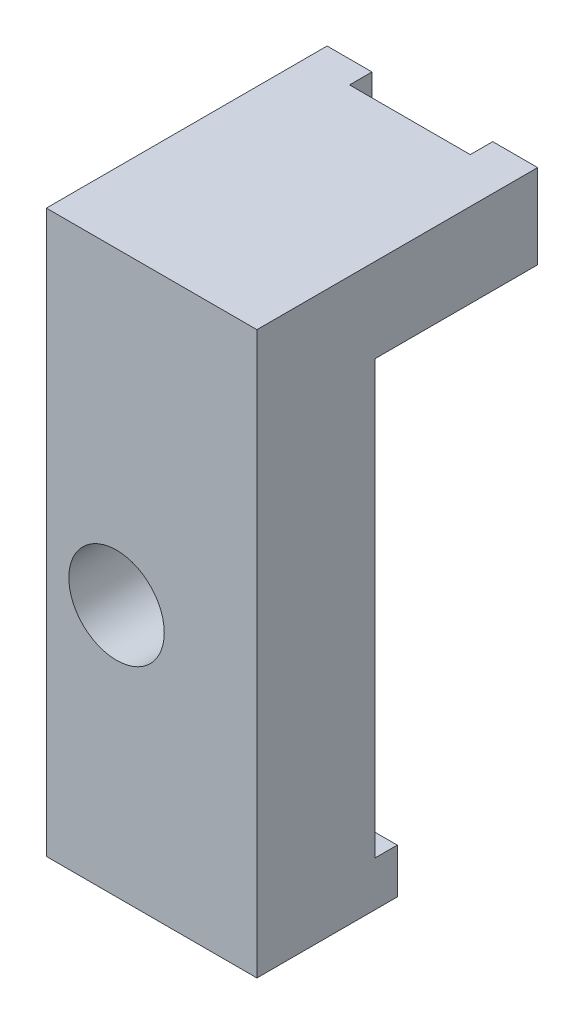
ISO-10303-21;
HEADER;
FILE_DESCRIPTION(('STEP AP214'),'2;1');
FILE_NAME('part.step','',(''),(''),'','','');
FILE_SCHEMA(('AUTOMOTIVE_DESIGN { 1 0 10303 214 1 1 1 1 }'));
ENDSEC;
DATA;
#1=APPLICATION_CONTEXT('core data for automotive mechanical design processes');
#2=APPLICATION_PROTOCOL_DEFINITION('international standard','automotive_design',2000,#1);
#3=PRODUCT_CONTEXT('',#1,'mechanical');
#4=PRODUCT('Part','Part','',(#3));
#5=PRODUCT_RELATED_PRODUCT_CATEGORY('part','',(#4));
#6=PRODUCT_DEFINITION_FORMATION('','',#4);
#7=PRODUCT_DEFINITION_CONTEXT('part definition',#1,'design');
#8=PRODUCT_DEFINITION('design','',#6,#7);
#9=PRODUCT_DEFINITION_SHAPE('','',#8);
#10=(LENGTH_UNIT() NAMED_UNIT(*) SI_UNIT(.MILLI.,.METRE.));
#11=(NAMED_UNIT(*) PLANE_ANGLE_UNIT() SI_UNIT($,.RADIAN.));
#12=(NAMED_UNIT(*) SI_UNIT($,.STERADIAN.) SOLID_ANGLE_UNIT());
#13=UNCERTAINTY_MEASURE_WITH_UNIT(LENGTH_MEASURE(1.E-05),#10,'distance_accuracy_value','');
#14=(GEOMETRIC_REPRESENTATION_CONTEXT(3) GLOBAL_UNCERTAINTY_ASSIGNED_CONTEXT((#13)) GLOBAL_UNIT_ASSIGNED_CONTEXT((#10,
#11,#12)) REPRESENTATION_CONTEXT('',''));
#15=CARTESIAN_POINT('',(0.,0.,0.));
#16=DIRECTION('',(0.,0.,1.));
#17=DIRECTION('',(1.,0.,0.));
#18=AXIS2_PLACEMENT_3D('',#15,#16,#17);
#19=CARTESIAN_POINT('',(0.,0.,-6.35));
#20=DIRECTION('',(0.,0.,1.));
#21=DIRECTION('',(1.,0.,0.));
#22=AXIS2_PLACEMENT_3D('',#19,#20,#21);
#23=PLANE('',#22);
#24=DIRECTION('',(1.,0.,0.));
#25=VECTOR('',#24,1.);
#26=CARTESIAN_POINT('',(-4.76350000000001,8.89,-6.35));
#27=LINE('',#26,#25);
#28=CARTESIAN_POINT('',(2.7305,8.89,-6.35));
#29=VERTEX_POINT('',#28);
#30=CARTESIAN_POINT('',(4.7625,8.89,-6.35));
#31=VERTEX_POINT('',#30);
#32=EDGE_CURVE('E191',#29,#31,#27,.T.);
#33=ORIENTED_EDGE('',*,*,#32,.F.);
#34=DIRECTION('',(0.,1.,0.));
#35=VECTOR('',#34,1.);
#36=CARTESIAN_POINT('',(2.7305,-12.701,-6.35));
#37=LINE('',#36,#35);
#38=CARTESIAN_POINT('',(2.7305,12.7,-6.35));
#39=VERTEX_POINT('',#38);
#40=EDGE_CURVE('E173',#29,#39,#37,.T.);
#41=ORIENTED_EDGE('',*,*,#40,.T.);
#42=DIRECTION('',(-1.,0.,0.));
#43=VECTOR('',#42,1.);
#44=CARTESIAN_POINT('',(-4.7625,12.7,-6.35));
#45=LINE('',#44,#43);
#46=CARTESIAN_POINT('',(4.7625,12.7,-6.35));
#47=VERTEX_POINT('',#46);
#48=EDGE_CURVE('E208',#47,#39,#45,.T.);
#49=ORIENTED_EDGE('',*,*,#48,.F.);
#50=DIRECTION('',(0.,1.,0.));
#51=VECTOR('',#50,1.);
#52=CARTESIAN_POINT('',(4.7625,12.7,-6.35));
#53=LINE('',#52,#51);
#54=EDGE_CURVE('E131',#31,#47,#53,.T.);
#55=ORIENTED_EDGE('',*,*,#54,.F.);
#56=EDGE_LOOP('',(#33,#41,#49,#55));
#57=FACE_BOUND('',#56,.T.);
#58=ADVANCED_FACE('F33',(#57),#23,.F.);
#59=CARTESIAN_POINT('',(4.7625,12.7,6.35));
#60=DIRECTION('',(-1.,0.,0.));
#61=DIRECTION('',(0.,-1.,0.));
#62=AXIS2_PLACEMENT_3D('',#59,#60,#61);
#63=PLANE('',#62);
#64=DIRECTION('',(0.,-1.,0.));
#65=VECTOR('',#64,1.);
#66=CARTESIAN_POINT('',(4.7625,-12.7,0.));
#67=LINE('',#66,#65);
#68=CARTESIAN_POINT('',(4.7625,-10.668,0.));
#69=VERTEX_POINT('',#68);
#70=CARTESIAN_POINT('',(4.7625,-12.7,0.));
#71=VERTEX_POINT('',#70);
#72=EDGE_CURVE('E189',#69,#71,#67,.T.);
#73=ORIENTED_EDGE('',*,*,#72,.F.);
#74=DIRECTION('',(0.,0.,-1.));
#75=VECTOR('',#74,1.);
#76=CARTESIAN_POINT('',(4.7625,-10.668,0.));
#77=LINE('',#76,#75);
#78=CARTESIAN_POINT('',(4.7625,-10.668,1.016));
#79=VERTEX_POINT('',#78);
#80=EDGE_CURVE('E148',#79,#69,#77,.T.);
#81=ORIENTED_EDGE('',*,*,#80,.F.);
#82=DIRECTION('',(0.,-1.,0.));
#83=VECTOR('',#82,1.);
#84=CARTESIAN_POINT('',(4.7625,-10.668,1.016));
#85=LINE('',#84,#83);
#86=CARTESIAN_POINT('',(4.7625,8.89,1.016));
#87=VERTEX_POINT('',#86);
#88=EDGE_CURVE('E151',#87,#79,#85,.T.);
#89=ORIENTED_EDGE('',*,*,#88,.F.);
#90=DIRECTION('',(0.,0.,1.));
#91=VECTOR('',#90,1.);
#92=CARTESIAN_POINT('',(4.7625,8.89,-6.35));
#93=LINE('',#92,#91);
#94=EDGE_CURVE('E138',#31,#87,#93,.T.);
#95=ORIENTED_EDGE('',*,*,#94,.F.);
#96=ORIENTED_EDGE('',*,*,#54,.T.);
#97=DIRECTION('',(0.,0.,-1.));
#98=VECTOR('',#97,1.);
#99=CARTESIAN_POINT('',(4.7625,12.7,6.35));
#100=LINE('',#99,#98);
#101=CARTESIAN_POINT('',(4.7625,12.7,6.35));
#102=VERTEX_POINT('',#101);
#103=EDGE_CURVE('E11',#102,#47,#100,.T.);
#104=ORIENTED_EDGE('',*,*,#103,.F.);
#105=DIRECTION('',(0.,1.,0.));
#106=VECTOR('',#105,1.);
#107=CARTESIAN_POINT('',(4.7625,12.7,6.35));
#108=LINE('',#107,#106);
#109=CARTESIAN_POINT('',(4.7625,-12.7,6.35));
#110=VERTEX_POINT('',#109);
#111=EDGE_CURVE('E196',#110,#102,#108,.T.);
#112=ORIENTED_EDGE('',*,*,#111,.F.);
#113=DIRECTION('',(0.,0.,-1.));
#114=VECTOR('',#113,1.);
#115=CARTESIAN_POINT('',(4.7625,-12.7,6.35));
#116=LINE('',#115,#114);
#117=EDGE_CURVE('E205',#110,#71,#116,.T.);
#118=ORIENTED_EDGE('',*,*,#117,.T.);
#119=EDGE_LOOP('',(#73,#81,#89,#95,#96,#104,#112,#118));
#120=FACE_BOUND('',#119,.T.);
#121=ADVANCED_FACE('F35',(#120),#63,.F.);
#122=CARTESIAN_POINT('',(-4.7625,12.7,6.35));
#123=DIRECTION('',(0.,-1.,0.));
#124=DIRECTION('',(0.,0.,-1.));
#125=AXIS2_PLACEMENT_3D('',#122,#123,#124);
#126=PLANE('',#125);
#127=ORIENTED_EDGE('',*,*,#48,.T.);
#128=DIRECTION('',(0.,0.,-1.));
#129=VECTOR('',#128,1.);
#130=CARTESIAN_POINT('',(2.7305,12.7,-6.35));
#131=LINE('',#130,#129);
#132=CARTESIAN_POINT('',(2.7305,12.7,-5.334));
#133=VERTEX_POINT('',#132);
#134=EDGE_CURVE('E165',#133,#39,#131,.T.);
#135=ORIENTED_EDGE('',*,*,#134,.F.);
#136=DIRECTION('',(1.,0.,0.));
#137=VECTOR('',#136,1.);
#138=CARTESIAN_POINT('',(2.7305,12.7,-5.334));
#139=LINE('',#138,#137);
#140=CARTESIAN_POINT('',(-2.7305,12.7,-5.334));
#141=VERTEX_POINT('',#140);
#142=EDGE_CURVE('E170',#141,#133,#139,.T.);
#143=ORIENTED_EDGE('',*,*,#142,.F.);
#144=DIRECTION('',(0.,0.,1.));
#145=VECTOR('',#144,1.);
#146=CARTESIAN_POINT('',(-2.7305,12.7,-6.35));
#147=LINE('',#146,#145);
#148=CARTESIAN_POINT('',(-2.7305,12.7,-6.35));
#149=VERTEX_POINT('',#148);
#150=EDGE_CURVE('E167',#149,#141,#147,.T.);
#151=ORIENTED_EDGE('',*,*,#150,.F.);
#152=CARTESIAN_POINT('',(-4.7625,12.7,-6.35));
#153=VERTEX_POINT('',#152);
#154=EDGE_CURVE('E207',#149,#153,#45,.T.);
#155=ORIENTED_EDGE('',*,*,#154,.T.);
#156=DIRECTION('',(0.,0.,-1.));
#157=VECTOR('',#156,1.);
#158=CARTESIAN_POINT('',(-4.7625,12.7,6.35));
#159=LINE('',#158,#157);
#160=CARTESIAN_POINT('',(-4.7625,12.7,6.35));
#161=VERTEX_POINT('',#160);
#162=EDGE_CURVE('E42',#161,#153,#159,.T.);
#163=ORIENTED_EDGE('',*,*,#162,.F.);
#164=DIRECTION('',(-1.,0.,0.));
#165=VECTOR('',#164,1.);
#166=CARTESIAN_POINT('',(-4.7625,12.7,6.35));
#167=LINE('',#166,#165);
#168=EDGE_CURVE('E199',#102,#161,#167,.T.);
#169=ORIENTED_EDGE('',*,*,#168,.F.);
#170=ORIENTED_EDGE('',*,*,#103,.T.);
#171=EDGE_LOOP('',(#127,#135,#143,#151,#155,#163,#169,#170));
#172=FACE_BOUND('',#171,.T.);
#173=ADVANCED_FACE('F233',(#172),#126,.F.);
#174=CARTESIAN_POINT('',(-4.7625,12.7,6.35));
#175=DIRECTION('',(1.,0.,0.));
#176=DIRECTION('',(0.,1.,0.));
#177=AXIS2_PLACEMENT_3D('',#174,#175,#176);
#178=PLANE('',#177);
#179=DIRECTION('',(0.,-1.,0.));
#180=VECTOR('',#179,1.);
#181=CARTESIAN_POINT('',(-4.7625,-10.668,1.016));
#182=LINE('',#181,#180);
#183=CARTESIAN_POINT('',(-4.76250000000001,8.89,1.016));
#184=VERTEX_POINT('',#183);
#185=CARTESIAN_POINT('',(-4.7625,-10.668,1.016));
#186=VERTEX_POINT('',#185);
#187=EDGE_CURVE('E127',#184,#186,#182,.T.);
#188=ORIENTED_EDGE('',*,*,#187,.T.);
#189=DIRECTION('',(0.,0.,-1.));
#190=VECTOR('',#189,1.);
#191=CARTESIAN_POINT('',(-4.7625,-10.668,0.));
#192=LINE('',#191,#190);
#193=CARTESIAN_POINT('',(-4.7625,-10.668,0.));
#194=VERTEX_POINT('',#193);
#195=EDGE_CURVE('E143',#186,#194,#192,.T.);
#196=ORIENTED_EDGE('',*,*,#195,.T.);
#197=DIRECTION('',(0.,1.,0.));
#198=VECTOR('',#197,1.);
#199=CARTESIAN_POINT('',(-4.7625,-12.7,0.));
#200=LINE('',#199,#198);
#201=CARTESIAN_POINT('',(-4.7625,-12.7,0.));
#202=VERTEX_POINT('',#201);
#203=EDGE_CURVE('E185',#202,#194,#200,.T.);
#204=ORIENTED_EDGE('',*,*,#203,.F.);
#205=DIRECTION('',(0.,0.,-1.));
#206=VECTOR('',#205,1.);
#207=CARTESIAN_POINT('',(-4.7625,-12.7,6.35));
#208=LINE('',#207,#206);
#209=CARTESIAN_POINT('',(-4.7625,-12.7,6.35));
#210=VERTEX_POINT('',#209);
#211=EDGE_CURVE('E214',#210,#202,#208,.T.);
#212=ORIENTED_EDGE('',*,*,#211,.F.);
#213=DIRECTION('',(0.,-1.,0.));
#214=VECTOR('',#213,1.);
#215=CARTESIAN_POINT('',(-4.7625,12.7,6.35));
#216=LINE('',#215,#214);
#217=EDGE_CURVE('E201',#161,#210,#216,.T.);
#218=ORIENTED_EDGE('',*,*,#217,.F.);
#219=ORIENTED_EDGE('',*,*,#162,.T.);
#220=DIRECTION('',(0.,-1.,0.));
#221=VECTOR('',#220,1.);
#222=CARTESIAN_POINT('',(-4.7625,12.7,-6.35));
#223=LINE('',#222,#221);
#224=CARTESIAN_POINT('',(-4.7625,8.89,-6.35));
#225=VERTEX_POINT('',#224);
#226=EDGE_CURVE('E130',#153,#225,#223,.T.);
#227=ORIENTED_EDGE('',*,*,#226,.T.);
#228=DIRECTION('',(0.,0.,-1.));
#229=VECTOR('',#228,1.);
#230=CARTESIAN_POINT('',(-4.7625,8.89,-6.35));
#231=LINE('',#230,#229);
#232=EDGE_CURVE('E57',#184,#225,#231,.T.);
#233=ORIENTED_EDGE('',*,*,#232,.F.);
#234=EDGE_LOOP('',(#188,#196,#204,#212,#218,#219,#227,#233));
#235=FACE_BOUND('',#234,.T.);
#236=ADVANCED_FACE('F124',(#235),#178,.F.);
#237=CARTESIAN_POINT('',(-4.7625,-12.7,6.35));
#238=DIRECTION('',(0.,1.,0.));
#239=DIRECTION('',(0.,0.,1.));
#240=AXIS2_PLACEMENT_3D('',#237,#238,#239);
#241=PLANE('',#240);
#242=ORIENTED_EDGE('',*,*,#211,.T.);
#243=DIRECTION('',(1.,0.,0.));
#244=VECTOR('',#243,1.);
#245=CARTESIAN_POINT('',(-4.7635,-12.7,0.));
#246=LINE('',#245,#244);
#247=EDGE_CURVE('E132',#202,#71,#246,.T.);
#248=ORIENTED_EDGE('',*,*,#247,.T.);
#249=ORIENTED_EDGE('',*,*,#117,.F.);
#250=DIRECTION('',(1.,0.,0.));
#251=VECTOR('',#250,1.);
#252=CARTESIAN_POINT('',(-4.7625,-12.7,6.35));
#253=LINE('',#252,#251);
#254=EDGE_CURVE('E203',#210,#110,#253,.T.);
#255=ORIENTED_EDGE('',*,*,#254,.F.);
#256=EDGE_LOOP('',(#242,#248,#249,#255));
#257=FACE_BOUND('',#256,.T.);
#258=ADVANCED_FACE('F251',(#257),#241,.F.);
#259=CARTESIAN_POINT('',(0.,0.,6.35));
#260=DIRECTION('',(0.,0.,1.));
#261=DIRECTION('',(1.,0.,0.));
#262=AXIS2_PLACEMENT_3D('',#259,#260,#261);
#263=PLANE('',#262);
#264=CARTESIAN_POINT('',(-1.5875,-1.27,6.35));
#265=DIRECTION('',(0.,0.,1.));
#266=DIRECTION('',(1.,0.,0.));
#267=AXIS2_PLACEMENT_3D('',#264,#265,#266);
#268=CIRCLE('',#267,2.159);
#269=CARTESIAN_POINT('',(0.571499999999997,-1.27,6.35));
#270=VERTEX_POINT('',#269);
#271=EDGE_CURVE('E176',#270,#270,#268,.T.);
#272=ORIENTED_EDGE('',*,*,#271,.F.);
#273=EDGE_LOOP('',(#272));
#274=FACE_BOUND('',#273,.T.);
#275=ORIENTED_EDGE('',*,*,#111,.T.);
#276=ORIENTED_EDGE('',*,*,#168,.T.);
#277=ORIENTED_EDGE('',*,*,#217,.T.);
#278=ORIENTED_EDGE('',*,*,#254,.T.);
#279=EDGE_LOOP('',(#275,#276,#277,#278));
#280=FACE_BOUND('',#279,.T.);
#281=ADVANCED_FACE('F255',(#274,#280),#263,.T.);
#282=ORIENTED_EDGE('',*,*,#154,.F.);
#283=DIRECTION('',(0.,1.,0.));
#284=VECTOR('',#283,1.);
#285=CARTESIAN_POINT('',(-2.7305,-12.701,-6.35));
#286=LINE('',#285,#284);
#287=CARTESIAN_POINT('',(-2.7305,8.88999999999999,-6.35));
#288=VERTEX_POINT('',#287);
#289=EDGE_CURVE('E179',#288,#149,#286,.T.);
#290=ORIENTED_EDGE('',*,*,#289,.F.);
#291=EDGE_CURVE('E194',#225,#288,#27,.T.);
#292=ORIENTED_EDGE('',*,*,#291,.F.);
#293=ORIENTED_EDGE('',*,*,#226,.F.);
#294=EDGE_LOOP('',(#282,#290,#292,#293));
#295=FACE_BOUND('',#294,.T.);
#296=ADVANCED_FACE('F223',(#295),#23,.F.);
#297=CARTESIAN_POINT('',(-4.7635,-12.7,0.));
#298=DIRECTION('',(0.,0.,1.));
#299=DIRECTION('',(1.,0.,0.));
#300=AXIS2_PLACEMENT_3D('',#297,#298,#299);
#301=PLANE('',#300);
#302=ORIENTED_EDGE('',*,*,#203,.T.);
#303=DIRECTION('',(1.,0.,0.));
#304=VECTOR('',#303,1.);
#305=CARTESIAN_POINT('',(-4.7625,-10.668,0.));
#306=LINE('',#305,#304);
#307=EDGE_CURVE('E155',#194,#69,#306,.T.);
#308=ORIENTED_EDGE('',*,*,#307,.T.);
#309=ORIENTED_EDGE('',*,*,#72,.T.);
#310=ORIENTED_EDGE('',*,*,#247,.F.);
#311=EDGE_LOOP('',(#302,#308,#309,#310));
#312=FACE_BOUND('',#311,.T.);
#313=ADVANCED_FACE('F247',(#312),#301,.F.);
#314=CARTESIAN_POINT('',(-4.76350000000001,8.89,-6.35));
#315=DIRECTION('',(0.,1.,0.));
#316=DIRECTION('',(0.,0.,1.));
#317=AXIS2_PLACEMENT_3D('',#314,#315,#316);
#318=PLANE('',#317);
#319=DIRECTION('',(-1.,0.,0.));
#320=VECTOR('',#319,1.);
#321=CARTESIAN_POINT('',(2.73049999999999,8.89,-5.334));
#322=LINE('',#321,#320);
#323=CARTESIAN_POINT('',(2.7305,8.88999999999999,-5.334));
#324=VERTEX_POINT('',#323);
#325=CARTESIAN_POINT('',(-2.7305,8.89,-5.334));
#326=VERTEX_POINT('',#325);
#327=EDGE_CURVE('E49',#324,#326,#322,.T.);
#328=ORIENTED_EDGE('',*,*,#327,.F.);
#329=DIRECTION('',(0.,0.,1.));
#330=VECTOR('',#329,1.);
#331=CARTESIAN_POINT('',(2.7305,8.89,-6.34999999999999));
#332=LINE('',#331,#330);
#333=EDGE_CURVE('E162',#29,#324,#332,.T.);
#334=ORIENTED_EDGE('',*,*,#333,.F.);
#335=ORIENTED_EDGE('',*,*,#32,.T.);
#336=ORIENTED_EDGE('',*,*,#94,.T.);
#337=DIRECTION('',(1.,0.,0.));
#338=VECTOR('',#337,1.);
#339=CARTESIAN_POINT('',(-4.76250000000001,8.89,1.016));
#340=LINE('',#339,#338);
#341=EDGE_CURVE('E135',#184,#87,#340,.T.);
#342=ORIENTED_EDGE('',*,*,#341,.F.);
#343=ORIENTED_EDGE('',*,*,#232,.T.);
#344=ORIENTED_EDGE('',*,*,#291,.T.);
#345=DIRECTION('',(0.,0.,-1.));
#346=VECTOR('',#345,1.);
#347=CARTESIAN_POINT('',(-2.7305,8.89,-6.34999999999999));
#348=LINE('',#347,#346);
#349=EDGE_CURVE('E159',#326,#288,#348,.T.);
#350=ORIENTED_EDGE('',*,*,#349,.F.);
#351=EDGE_LOOP('',(#328,#334,#335,#336,#342,#343,#344,#350));
#352=FACE_BOUND('',#351,.T.);
#353=ADVANCED_FACE('F136',(#352),#318,.F.);
#354=CARTESIAN_POINT('',(-1.5875,-1.27,-6.351));
#355=DIRECTION('',(0.,0.,1.));
#356=DIRECTION('',(1.,0.,0.));
#357=AXIS2_PLACEMENT_3D('',#354,#355,#356);
#358=CYLINDRICAL_SURFACE('',#357,2.159);
#359=CARTESIAN_POINT('',(-1.5875,-1.27,1.016));
#360=DIRECTION('',(0.,0.,1.));
#361=DIRECTION('',(1.,0.,0.));
#362=AXIS2_PLACEMENT_3D('',#359,#360,#361);
#363=CIRCLE('',#362,2.159);
#364=CARTESIAN_POINT('',(0.571499999999997,-1.27,1.016));
#365=VERTEX_POINT('',#364);
#366=EDGE_CURVE('E37',#365,#365,#363,.F.);
#367=ORIENTED_EDGE('',*,*,#366,.T.);
#368=EDGE_LOOP('',(#367));
#369=FACE_BOUND('',#368,.T.);
#370=ORIENTED_EDGE('',*,*,#271,.T.);
#371=EDGE_LOOP('',(#370));
#372=FACE_BOUND('',#371,.T.);
#373=ADVANCED_FACE('F303',(#369,#372),#358,.F.);
#374=CARTESIAN_POINT('',(2.7305,-12.701,-6.35));
#375=DIRECTION('',(1.,0.,0.));
#376=DIRECTION('',(0.,0.,-1.));
#377=AXIS2_PLACEMENT_3D('',#374,#375,#376);
#378=PLANE('',#377);
#379=ORIENTED_EDGE('',*,*,#333,.T.);
#380=DIRECTION('',(0.,1.,0.));
#381=VECTOR('',#380,1.);
#382=CARTESIAN_POINT('',(2.7305,-12.701,-5.334));
#383=LINE('',#382,#381);
#384=EDGE_CURVE('E174',#324,#133,#383,.T.);
#385=ORIENTED_EDGE('',*,*,#384,.T.);
#386=ORIENTED_EDGE('',*,*,#134,.T.);
#387=ORIENTED_EDGE('',*,*,#40,.F.);
#388=EDGE_LOOP('',(#379,#385,#386,#387));
#389=FACE_BOUND('',#388,.T.);
#390=ADVANCED_FACE('F236',(#389),#378,.F.);
#391=CARTESIAN_POINT('',(2.7305,-12.701,-5.334));
#392=DIRECTION('',(0.,0.,1.));
#393=DIRECTION('',(1.,0.,0.));
#394=AXIS2_PLACEMENT_3D('',#391,#392,#393);
#395=PLANE('',#394);
#396=ORIENTED_EDGE('',*,*,#327,.T.);
#397=DIRECTION('',(0.,1.,0.));
#398=VECTOR('',#397,1.);
#399=CARTESIAN_POINT('',(-2.7305,-12.701,-5.334));
#400=LINE('',#399,#398);
#401=EDGE_CURVE('E177',#326,#141,#400,.T.);
#402=ORIENTED_EDGE('',*,*,#401,.T.);
#403=ORIENTED_EDGE('',*,*,#142,.T.);
#404=ORIENTED_EDGE('',*,*,#384,.F.);
#405=EDGE_LOOP('',(#396,#402,#403,#404));
#406=FACE_BOUND('',#405,.T.);
#407=ADVANCED_FACE('F231',(#406),#395,.F.);
#408=CARTESIAN_POINT('',(-2.7305,-12.701,-6.35));
#409=DIRECTION('',(-1.,0.,0.));
#410=DIRECTION('',(0.,0.,1.));
#411=AXIS2_PLACEMENT_3D('',#408,#409,#410);
#412=PLANE('',#411);
#413=ORIENTED_EDGE('',*,*,#349,.T.);
#414=ORIENTED_EDGE('',*,*,#289,.T.);
#415=ORIENTED_EDGE('',*,*,#150,.T.);
#416=ORIENTED_EDGE('',*,*,#401,.F.);
#417=EDGE_LOOP('',(#413,#414,#415,#416));
#418=FACE_BOUND('',#417,.T.);
#419=ADVANCED_FACE('F228',(#418),#412,.F.);
#420=CARTESIAN_POINT('',(-4.7625,-10.668,1.016));
#421=DIRECTION('',(0.,0.,1.));
#422=DIRECTION('',(1.,0.,0.));
#423=AXIS2_PLACEMENT_3D('',#420,#421,#422);
#424=PLANE('',#423);
#425=ORIENTED_EDGE('',*,*,#88,.T.);
#426=DIRECTION('',(1.,0.,0.));
#427=VECTOR('',#426,1.);
#428=CARTESIAN_POINT('',(-4.7625,-10.668,1.016));
#429=LINE('',#428,#427);
#430=EDGE_CURVE('E142',#186,#79,#429,.T.);
#431=ORIENTED_EDGE('',*,*,#430,.F.);
#432=ORIENTED_EDGE('',*,*,#187,.F.);
#433=ORIENTED_EDGE('',*,*,#341,.T.);
#434=EDGE_LOOP('',(#425,#431,#432,#433));
#435=FACE_BOUND('',#434,.T.);
#436=ORIENTED_EDGE('',*,*,#366,.F.);
#437=EDGE_LOOP('',(#436));
#438=FACE_BOUND('',#437,.T.);
#439=ADVANCED_FACE('F145',(#435,#438),#424,.F.);
#440=CARTESIAN_POINT('',(-4.7625,-10.668,0.));
#441=DIRECTION('',(0.,-1.,0.));
#442=DIRECTION('',(1.,0.,0.));
#443=AXIS2_PLACEMENT_3D('',#440,#441,#442);
#444=PLANE('',#443);
#445=ORIENTED_EDGE('',*,*,#80,.T.);
#446=ORIENTED_EDGE('',*,*,#307,.F.);
#447=ORIENTED_EDGE('',*,*,#195,.F.);
#448=ORIENTED_EDGE('',*,*,#430,.T.);
#449=EDGE_LOOP('',(#445,#446,#447,#448));
#450=FACE_BOUND('',#449,.T.);
#451=ADVANCED_FACE('F245',(#450),#444,.F.);
#452=CLOSED_SHELL('',(#58,#121,#173,#236,#258,#281,#296,#313,#353,#373,#390,#407,#419,#439,#451));
#453=MANIFOLD_SOLID_BREP('B2',#452);
#454=ADVANCED_BREP_SHAPE_REPRESENTATION('',(#18,#453),#14);
#455=SHAPE_DEFINITION_REPRESENTATION(#9,#454);
ENDSEC;
END-ISO-10303-21;
